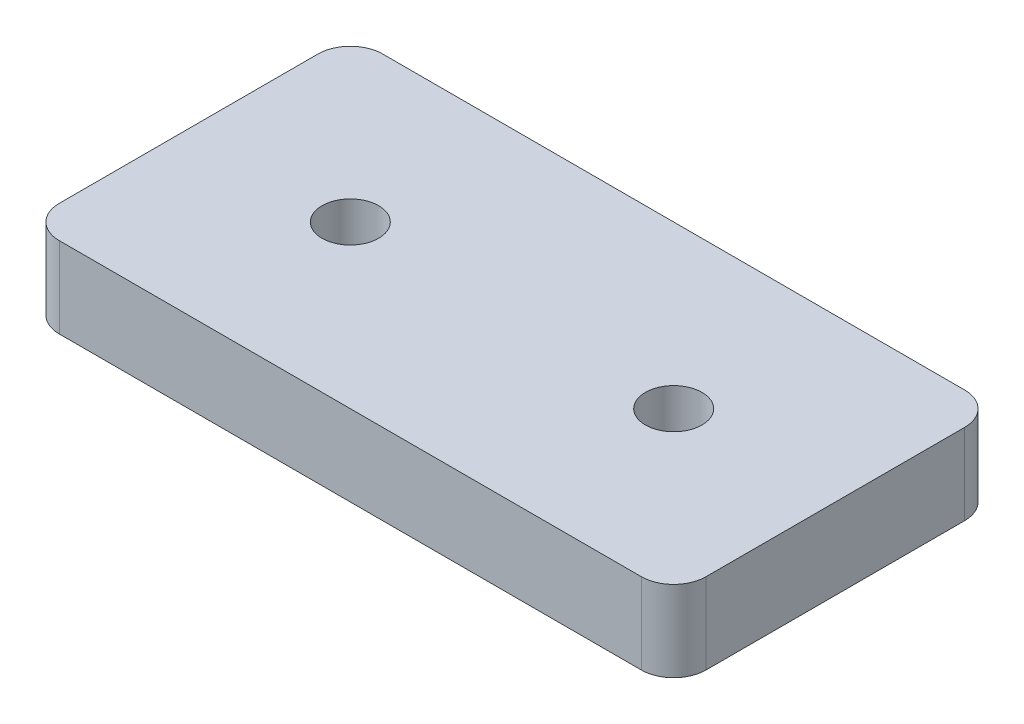
ISO-10303-21;
HEADER;
FILE_DESCRIPTION(('STEP AP214'),'2;1');
FILE_NAME('part.step','',(''),(''),'','','');
FILE_SCHEMA(('AUTOMOTIVE_DESIGN { 1 0 10303 214 1 1 1 1 }'));
ENDSEC;
DATA;
#1=APPLICATION_CONTEXT('core data for automotive mechanical design processes');
#2=APPLICATION_PROTOCOL_DEFINITION('international standard','automotive_design',2000,#1);
#3=PRODUCT_CONTEXT('',#1,'mechanical');
#4=PRODUCT('Part','Part','',(#3));
#5=PRODUCT_RELATED_PRODUCT_CATEGORY('part','',(#4));
#6=PRODUCT_DEFINITION_FORMATION('','',#4);
#7=PRODUCT_DEFINITION_CONTEXT('part definition',#1,'design');
#8=PRODUCT_DEFINITION('design','',#6,#7);
#9=PRODUCT_DEFINITION_SHAPE('','',#8);
#10=(LENGTH_UNIT() NAMED_UNIT(*) SI_UNIT(.MILLI.,.METRE.));
#11=(NAMED_UNIT(*) PLANE_ANGLE_UNIT() SI_UNIT($,.RADIAN.));
#12=(NAMED_UNIT(*) SI_UNIT($,.STERADIAN.) SOLID_ANGLE_UNIT());
#13=UNCERTAINTY_MEASURE_WITH_UNIT(LENGTH_MEASURE(1.E-05),#10,'distance_accuracy_value','');
#14=(GEOMETRIC_REPRESENTATION_CONTEXT(3) GLOBAL_UNCERTAINTY_ASSIGNED_CONTEXT((#13)) GLOBAL_UNIT_ASSIGNED_CONTEXT((#10,
#11,#12)) REPRESENTATION_CONTEXT('',''));
#15=CARTESIAN_POINT('',(0.,0.,0.));
#16=DIRECTION('',(0.,0.,1.));
#17=DIRECTION('',(1.,0.,0.));
#18=AXIS2_PLACEMENT_3D('',#15,#16,#17);
#19=CARTESIAN_POINT('',(30.,5.,0.));
#20=DIRECTION('',(-1.,0.,0.));
#21=DIRECTION('',(0.,0.,1.));
#22=AXIS2_PLACEMENT_3D('',#19,#20,#21);
#23=PLANE('',#22);
#24=DIRECTION('',(0.,0.,-1.));
#25=VECTOR('',#24,1.);
#26=CARTESIAN_POINT('',(30.,5.,0.));
#27=LINE('',#26,#25);
#28=CARTESIAN_POINT('',(30.,5.,8.));
#29=VERTEX_POINT('',#28);
#30=CARTESIAN_POINT('',(30.,5.,-8.00000000000001));
#31=VERTEX_POINT('',#30);
#32=EDGE_CURVE('E124',#29,#31,#27,.T.);
#33=ORIENTED_EDGE('',*,*,#32,.F.);
#34=DIRECTION('',(0.,-1.,0.));
#35=VECTOR('',#34,1.);
#36=CARTESIAN_POINT('',(30.,0.,8.));
#37=LINE('',#36,#35);
#38=CARTESIAN_POINT('',(30.,0.,8.));
#39=VERTEX_POINT('',#38);
#40=EDGE_CURVE('E115',#29,#39,#37,.T.);
#41=ORIENTED_EDGE('',*,*,#40,.T.);
#42=DIRECTION('',(0.,0.,-1.));
#43=VECTOR('',#42,1.);
#44=CARTESIAN_POINT('',(30.,0.,0.));
#45=LINE('',#44,#43);
#46=CARTESIAN_POINT('',(30.,0.,-8.00000000000001));
#47=VERTEX_POINT('',#46);
#48=EDGE_CURVE('E125',#39,#47,#45,.T.);
#49=ORIENTED_EDGE('',*,*,#48,.T.);
#50=DIRECTION('',(0.,-1.,0.));
#51=VECTOR('',#50,1.);
#52=CARTESIAN_POINT('',(30.,5.,-8.00000000000001));
#53=LINE('',#52,#51);
#54=EDGE_CURVE('E127',#47,#31,#53,.F.);
#55=ORIENTED_EDGE('',*,*,#54,.T.);
#56=EDGE_LOOP('',(#33,#41,#49,#55));
#57=FACE_BOUND('',#56,.T.);
#58=ADVANCED_FACE('F43',(#57),#23,.F.);
#59=CARTESIAN_POINT('',(0.,5.,-10.));
#60=DIRECTION('',(0.,0.,1.));
#61=DIRECTION('',(1.,0.,0.));
#62=AXIS2_PLACEMENT_3D('',#59,#60,#61);
#63=PLANE('',#62);
#64=DIRECTION('',(-1.,0.,0.));
#65=VECTOR('',#64,1.);
#66=CARTESIAN_POINT('',(0.,0.,-10.));
#67=LINE('',#66,#65);
#68=CARTESIAN_POINT('',(28.,0.,-10.));
#69=VERTEX_POINT('',#68);
#70=CARTESIAN_POINT('',(-8.,0.,-10.));
#71=VERTEX_POINT('',#70);
#72=EDGE_CURVE('E129',#69,#71,#67,.T.);
#73=ORIENTED_EDGE('',*,*,#72,.T.);
#74=DIRECTION('',(0.,-1.,0.));
#75=VECTOR('',#74,1.);
#76=CARTESIAN_POINT('',(-8.,5.,-10.));
#77=LINE('',#76,#75);
#78=CARTESIAN_POINT('',(-8.,5.,-10.));
#79=VERTEX_POINT('',#78);
#80=EDGE_CURVE('E51',#71,#79,#77,.F.);
#81=ORIENTED_EDGE('',*,*,#80,.T.);
#82=DIRECTION('',(-1.,0.,0.));
#83=VECTOR('',#82,1.);
#84=CARTESIAN_POINT('',(0.,5.,-10.));
#85=LINE('',#84,#83);
#86=CARTESIAN_POINT('',(28.,5.,-10.));
#87=VERTEX_POINT('',#86);
#88=EDGE_CURVE('E188',#87,#79,#85,.T.);
#89=ORIENTED_EDGE('',*,*,#88,.F.);
#90=DIRECTION('',(0.,-1.,0.));
#91=VECTOR('',#90,1.);
#92=CARTESIAN_POINT('',(28.,5.,-10.));
#93=LINE('',#92,#91);
#94=EDGE_CURVE('E151',#87,#69,#93,.T.);
#95=ORIENTED_EDGE('',*,*,#94,.T.);
#96=EDGE_LOOP('',(#73,#81,#89,#95));
#97=FACE_BOUND('',#96,.T.);
#98=ADVANCED_FACE('F209',(#97),#63,.F.);
#99=CARTESIAN_POINT('',(-10.,5.,0.));
#100=DIRECTION('',(-1.,0.,0.));
#101=DIRECTION('',(0.,0.,1.));
#102=AXIS2_PLACEMENT_3D('',#99,#100,#101);
#103=PLANE('',#102);
#104=DIRECTION('',(0.,0.,-1.));
#105=VECTOR('',#104,1.);
#106=CARTESIAN_POINT('',(-10.,5.,0.));
#107=LINE('',#106,#105);
#108=CARTESIAN_POINT('',(-10.,5.,8.));
#109=VERTEX_POINT('',#108);
#110=CARTESIAN_POINT('',(-10.,5.,-8.));
#111=VERTEX_POINT('',#110);
#112=EDGE_CURVE('E171',#109,#111,#107,.T.);
#113=ORIENTED_EDGE('',*,*,#112,.T.);
#114=DIRECTION('',(0.,-1.,0.));
#115=VECTOR('',#114,1.);
#116=CARTESIAN_POINT('',(-10.,0.,-8.));
#117=LINE('',#116,#115);
#118=CARTESIAN_POINT('',(-10.,0.,-8.));
#119=VERTEX_POINT('',#118);
#120=EDGE_CURVE('E162',#111,#119,#117,.T.);
#121=ORIENTED_EDGE('',*,*,#120,.T.);
#122=DIRECTION('',(0.,0.,-1.));
#123=VECTOR('',#122,1.);
#124=CARTESIAN_POINT('',(-10.,0.,0.));
#125=LINE('',#124,#123);
#126=CARTESIAN_POINT('',(-10.,0.,8.));
#127=VERTEX_POINT('',#126);
#128=EDGE_CURVE('E135',#127,#119,#125,.T.);
#129=ORIENTED_EDGE('',*,*,#128,.F.);
#130=DIRECTION('',(0.,-1.,0.));
#131=VECTOR('',#130,1.);
#132=CARTESIAN_POINT('',(-10.,5.,8.));
#133=LINE('',#132,#131);
#134=EDGE_CURVE('E157',#127,#109,#133,.F.);
#135=ORIENTED_EDGE('',*,*,#134,.T.);
#136=EDGE_LOOP('',(#113,#121,#129,#135));
#137=FACE_BOUND('',#136,.T.);
#138=ADVANCED_FACE('F168',(#137),#103,.T.);
#139=CARTESIAN_POINT('',(0.,5.,0.));
#140=DIRECTION('',(0.,-1.,0.));
#141=DIRECTION('',(0.,0.,-1.));
#142=AXIS2_PLACEMENT_3D('',#139,#140,#141);
#143=CYLINDRICAL_SURFACE('',#142,1.75);
#144=CARTESIAN_POINT('',(0.,5.,0.));
#145=DIRECTION('',(0.,1.,0.));
#146=DIRECTION('',(0.,0.,1.));
#147=AXIS2_PLACEMENT_3D('',#144,#145,#146);
#148=CIRCLE('',#147,1.75);
#149=CARTESIAN_POINT('',(0.,5.,1.75));
#150=VERTEX_POINT('',#149);
#151=EDGE_CURVE('E227',#150,#150,#148,.T.);
#152=ORIENTED_EDGE('',*,*,#151,.T.);
#153=EDGE_LOOP('',(#152));
#154=FACE_BOUND('',#153,.T.);
#155=CARTESIAN_POINT('',(0.,0.,0.));
#156=DIRECTION('',(0.,1.,0.));
#157=DIRECTION('',(0.,0.,1.));
#158=AXIS2_PLACEMENT_3D('',#155,#156,#157);
#159=CIRCLE('',#158,1.75);
#160=CARTESIAN_POINT('',(0.,0.,1.75));
#161=VERTEX_POINT('',#160);
#162=EDGE_CURVE('E128',#161,#161,#159,.T.);
#163=ORIENTED_EDGE('',*,*,#162,.F.);
#164=EDGE_LOOP('',(#163));
#165=FACE_BOUND('',#164,.T.);
#166=ADVANCED_FACE('F198',(#154,#165),#143,.F.);
#167=CARTESIAN_POINT('',(20.,5.,0.));
#168=DIRECTION('',(0.,-1.,0.));
#169=DIRECTION('',(0.,0.,-1.));
#170=AXIS2_PLACEMENT_3D('',#167,#168,#169);
#171=CYLINDRICAL_SURFACE('',#170,1.75);
#172=CARTESIAN_POINT('',(20.,5.,0.));
#173=DIRECTION('',(0.,1.,0.));
#174=DIRECTION('',(0.,0.,1.));
#175=AXIS2_PLACEMENT_3D('',#172,#173,#174);
#176=CIRCLE('',#175,1.75);
#177=CARTESIAN_POINT('',(20.,5.,1.75));
#178=VERTEX_POINT('',#177);
#179=EDGE_CURVE('E142',#178,#178,#176,.T.);
#180=ORIENTED_EDGE('',*,*,#179,.T.);
#181=EDGE_LOOP('',(#180));
#182=FACE_BOUND('',#181,.T.);
#183=CARTESIAN_POINT('',(20.,0.,0.));
#184=DIRECTION('',(0.,1.,0.));
#185=DIRECTION('',(0.,0.,1.));
#186=AXIS2_PLACEMENT_3D('',#183,#184,#185);
#187=CIRCLE('',#186,1.75);
#188=CARTESIAN_POINT('',(20.,0.,1.75));
#189=VERTEX_POINT('',#188);
#190=EDGE_CURVE('E132',#189,#189,#187,.T.);
#191=ORIENTED_EDGE('',*,*,#190,.F.);
#192=EDGE_LOOP('',(#191));
#193=FACE_BOUND('',#192,.T.);
#194=ADVANCED_FACE('F193',(#182,#193),#171,.F.);
#195=CARTESIAN_POINT('',(0.,5.,10.));
#196=DIRECTION('',(0.,0.,1.));
#197=DIRECTION('',(1.,0.,0.));
#198=AXIS2_PLACEMENT_3D('',#195,#196,#197);
#199=PLANE('',#198);
#200=DIRECTION('',(-1.,0.,0.));
#201=VECTOR('',#200,1.);
#202=CARTESIAN_POINT('',(0.,5.,10.));
#203=LINE('',#202,#201);
#204=CARTESIAN_POINT('',(28.,5.,10.));
#205=VERTEX_POINT('',#204);
#206=CARTESIAN_POINT('',(-8.,5.,10.));
#207=VERTEX_POINT('',#206);
#208=EDGE_CURVE('E141',#205,#207,#203,.T.);
#209=ORIENTED_EDGE('',*,*,#208,.T.);
#210=DIRECTION('',(0.,-1.,0.));
#211=VECTOR('',#210,1.);
#212=CARTESIAN_POINT('',(-8.,5.,10.));
#213=LINE('',#212,#211);
#214=CARTESIAN_POINT('',(-8.,0.,10.));
#215=VERTEX_POINT('',#214);
#216=EDGE_CURVE('E152',#207,#215,#213,.T.);
#217=ORIENTED_EDGE('',*,*,#216,.T.);
#218=DIRECTION('',(-1.,0.,0.));
#219=VECTOR('',#218,1.);
#220=CARTESIAN_POINT('',(0.,0.,10.));
#221=LINE('',#220,#219);
#222=CARTESIAN_POINT('',(28.,0.,10.));
#223=VERTEX_POINT('',#222);
#224=EDGE_CURVE('E137',#223,#215,#221,.T.);
#225=ORIENTED_EDGE('',*,*,#224,.F.);
#226=DIRECTION('',(0.,-1.,0.));
#227=VECTOR('',#226,1.);
#228=CARTESIAN_POINT('',(28.,5.,10.));
#229=LINE('',#228,#227);
#230=EDGE_CURVE('E114',#223,#205,#229,.F.);
#231=ORIENTED_EDGE('',*,*,#230,.T.);
#232=EDGE_LOOP('',(#209,#217,#225,#231));
#233=FACE_BOUND('',#232,.T.);
#234=ADVANCED_FACE('F185',(#233),#199,.T.);
#235=CARTESIAN_POINT('',(0.,5.,0.));
#236=DIRECTION('',(0.,1.,0.));
#237=DIRECTION('',(0.,0.,1.));
#238=AXIS2_PLACEMENT_3D('',#235,#236,#237);
#239=PLANE('',#238);
#240=ORIENTED_EDGE('',*,*,#179,.F.);
#241=EDGE_LOOP('',(#240));
#242=FACE_BOUND('',#241,.T.);
#243=ORIENTED_EDGE('',*,*,#151,.F.);
#244=EDGE_LOOP('',(#243));
#245=FACE_BOUND('',#244,.T.);
#246=ORIENTED_EDGE('',*,*,#88,.T.);
#247=CARTESIAN_POINT('',(-8.,5.,-8.));
#248=DIRECTION('',(0.,1.,0.));
#249=DIRECTION('',(0.,0.,1.));
#250=AXIS2_PLACEMENT_3D('',#247,#248,#249);
#251=CIRCLE('',#250,2.);
#252=EDGE_CURVE('E11',#79,#111,#251,.T.);
#253=ORIENTED_EDGE('',*,*,#252,.T.);
#254=ORIENTED_EDGE('',*,*,#112,.F.);
#255=CARTESIAN_POINT('',(-8.,5.,8.));
#256=DIRECTION('',(0.,1.,0.));
#257=DIRECTION('',(0.,0.,1.));
#258=AXIS2_PLACEMENT_3D('',#255,#256,#257);
#259=CIRCLE('',#258,2.);
#260=EDGE_CURVE('E161',#109,#207,#259,.T.);
#261=ORIENTED_EDGE('',*,*,#260,.T.);
#262=ORIENTED_EDGE('',*,*,#208,.F.);
#263=CARTESIAN_POINT('',(28.,5.,8.));
#264=DIRECTION('',(0.,1.,0.));
#265=DIRECTION('',(0.,0.,1.));
#266=AXIS2_PLACEMENT_3D('',#263,#264,#265);
#267=CIRCLE('',#266,2.);
#268=EDGE_CURVE('E149',#205,#29,#267,.T.);
#269=ORIENTED_EDGE('',*,*,#268,.T.);
#270=ORIENTED_EDGE('',*,*,#32,.T.);
#271=CARTESIAN_POINT('',(28.,5.,-8.00000000000001));
#272=DIRECTION('',(0.,1.,0.));
#273=DIRECTION('',(0.,0.,1.));
#274=AXIS2_PLACEMENT_3D('',#271,#272,#273);
#275=CIRCLE('',#274,2.);
#276=EDGE_CURVE('E150',#31,#87,#275,.T.);
#277=ORIENTED_EDGE('',*,*,#276,.T.);
#278=EDGE_LOOP('',(#246,#253,#254,#261,#262,#269,#270,#277));
#279=FACE_BOUND('',#278,.T.);
#280=ADVANCED_FACE('F204',(#242,#245,#279),#239,.T.);
#281=CARTESIAN_POINT('',(0.,0.,0.));
#282=DIRECTION('',(0.,1.,0.));
#283=DIRECTION('',(0.,0.,1.));
#284=AXIS2_PLACEMENT_3D('',#281,#282,#283);
#285=PLANE('',#284);
#286=ORIENTED_EDGE('',*,*,#190,.T.);
#287=EDGE_LOOP('',(#286));
#288=FACE_BOUND('',#287,.T.);
#289=ORIENTED_EDGE('',*,*,#162,.T.);
#290=EDGE_LOOP('',(#289));
#291=FACE_BOUND('',#290,.T.);
#292=ORIENTED_EDGE('',*,*,#128,.T.);
#293=CARTESIAN_POINT('',(-8.,0.,-8.));
#294=DIRECTION('',(0.,1.,0.));
#295=DIRECTION('',(0.,0.,1.));
#296=AXIS2_PLACEMENT_3D('',#293,#294,#295);
#297=CIRCLE('',#296,2.);
#298=EDGE_CURVE('E62',#119,#71,#297,.F.);
#299=ORIENTED_EDGE('',*,*,#298,.T.);
#300=ORIENTED_EDGE('',*,*,#72,.F.);
#301=CARTESIAN_POINT('',(28.,0.,-8.00000000000001));
#302=DIRECTION('',(0.,1.,0.));
#303=DIRECTION('',(0.,0.,1.));
#304=AXIS2_PLACEMENT_3D('',#301,#302,#303);
#305=CIRCLE('',#304,2.);
#306=EDGE_CURVE('E120',#69,#47,#305,.F.);
#307=ORIENTED_EDGE('',*,*,#306,.T.);
#308=ORIENTED_EDGE('',*,*,#48,.F.);
#309=CARTESIAN_POINT('',(28.,0.,8.));
#310=DIRECTION('',(0.,1.,0.));
#311=DIRECTION('',(0.,0.,1.));
#312=AXIS2_PLACEMENT_3D('',#309,#310,#311);
#313=CIRCLE('',#312,2.);
#314=EDGE_CURVE('E107',#39,#223,#313,.F.);
#315=ORIENTED_EDGE('',*,*,#314,.T.);
#316=ORIENTED_EDGE('',*,*,#224,.T.);
#317=CARTESIAN_POINT('',(-8.,0.,8.));
#318=DIRECTION('',(0.,1.,0.));
#319=DIRECTION('',(0.,0.,1.));
#320=AXIS2_PLACEMENT_3D('',#317,#318,#319);
#321=CIRCLE('',#320,2.);
#322=EDGE_CURVE('E160',#215,#127,#321,.F.);
#323=ORIENTED_EDGE('',*,*,#322,.T.);
#324=EDGE_LOOP('',(#292,#299,#300,#307,#308,#315,#316,#323));
#325=FACE_BOUND('',#324,.T.);
#326=ADVANCED_FACE('F126',(#288,#291,#325),#285,.F.);
#327=CARTESIAN_POINT('',(28.,5.,8.));
#328=DIRECTION('',(0.,1.,0.));
#329=DIRECTION('',(0.,0.,1.));
#330=AXIS2_PLACEMENT_3D('',#327,#328,#329);
#331=CYLINDRICAL_SURFACE('',#330,2.);
#332=ORIENTED_EDGE('',*,*,#268,.F.);
#333=ORIENTED_EDGE('',*,*,#230,.F.);
#334=ORIENTED_EDGE('',*,*,#314,.F.);
#335=ORIENTED_EDGE('',*,*,#40,.F.);
#336=EDGE_LOOP('',(#332,#333,#334,#335));
#337=FACE_BOUND('',#336,.T.);
#338=ADVANCED_FACE('F112',(#337),#331,.T.);
#339=CARTESIAN_POINT('',(28.,5.,-8.00000000000001));
#340=DIRECTION('',(0.,-1.,0.));
#341=DIRECTION('',(0.,0.,-1.));
#342=AXIS2_PLACEMENT_3D('',#339,#340,#341);
#343=CYLINDRICAL_SURFACE('',#342,2.);
#344=ORIENTED_EDGE('',*,*,#276,.F.);
#345=ORIENTED_EDGE('',*,*,#54,.F.);
#346=ORIENTED_EDGE('',*,*,#306,.F.);
#347=ORIENTED_EDGE('',*,*,#94,.F.);
#348=EDGE_LOOP('',(#344,#345,#346,#347));
#349=FACE_BOUND('',#348,.T.);
#350=ADVANCED_FACE('F240',(#349),#343,.T.);
#351=CARTESIAN_POINT('',(-8.,5.,8.));
#352=DIRECTION('',(0.,-1.,0.));
#353=DIRECTION('',(0.,0.,-1.));
#354=AXIS2_PLACEMENT_3D('',#351,#352,#353);
#355=CYLINDRICAL_SURFACE('',#354,2.);
#356=ORIENTED_EDGE('',*,*,#260,.F.);
#357=ORIENTED_EDGE('',*,*,#134,.F.);
#358=ORIENTED_EDGE('',*,*,#322,.F.);
#359=ORIENTED_EDGE('',*,*,#216,.F.);
#360=EDGE_LOOP('',(#356,#357,#358,#359));
#361=FACE_BOUND('',#360,.T.);
#362=ADVANCED_FACE('F178',(#361),#355,.T.);
#363=CARTESIAN_POINT('',(-8.,5.,-8.));
#364=DIRECTION('',(0.,1.,0.));
#365=DIRECTION('',(0.,0.,1.));
#366=AXIS2_PLACEMENT_3D('',#363,#364,#365);
#367=CYLINDRICAL_SURFACE('',#366,2.);
#368=ORIENTED_EDGE('',*,*,#252,.F.);
#369=ORIENTED_EDGE('',*,*,#80,.F.);
#370=ORIENTED_EDGE('',*,*,#298,.F.);
#371=ORIENTED_EDGE('',*,*,#120,.F.);
#372=EDGE_LOOP('',(#368,#369,#370,#371));
#373=FACE_BOUND('',#372,.T.);
#374=ADVANCED_FACE('F44',(#373),#367,.T.);
#375=CLOSED_SHELL('',(#58,#98,#138,#166,#194,#234,#280,#326,#338,#350,#362,#374));
#376=MANIFOLD_SOLID_BREP('B2',#375);
#377=ADVANCED_BREP_SHAPE_REPRESENTATION('',(#18,#376),#14);
#378=SHAPE_DEFINITION_REPRESENTATION(#9,#377);
ENDSEC;
END-ISO-10303-21;
